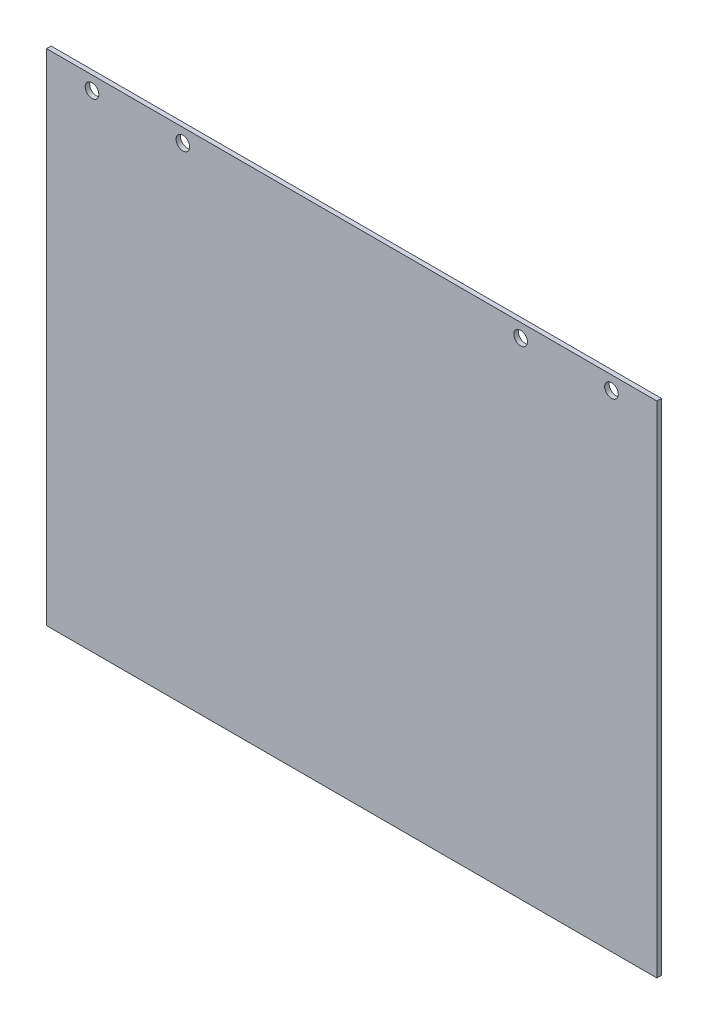
ISO-10303-21;
HEADER;
FILE_DESCRIPTION(('STEP AP214'),'2;1');
FILE_NAME('part.step','',(''),(''),'','','');
FILE_SCHEMA(('AUTOMOTIVE_DESIGN { 1 0 10303 214 1 1 1 1 }'));
ENDSEC;
DATA;
#1=APPLICATION_CONTEXT('core data for automotive mechanical design processes');
#2=APPLICATION_PROTOCOL_DEFINITION('international standard','automotive_design',2000,#1);
#3=PRODUCT_CONTEXT('',#1,'mechanical');
#4=PRODUCT('Part','Part','',(#3));
#5=PRODUCT_RELATED_PRODUCT_CATEGORY('part','',(#4));
#6=PRODUCT_DEFINITION_FORMATION('','',#4);
#7=PRODUCT_DEFINITION_CONTEXT('part definition',#1,'design');
#8=PRODUCT_DEFINITION('design','',#6,#7);
#9=PRODUCT_DEFINITION_SHAPE('','',#8);
#10=(LENGTH_UNIT() NAMED_UNIT(*) SI_UNIT(.MILLI.,.METRE.));
#11=(NAMED_UNIT(*) PLANE_ANGLE_UNIT() SI_UNIT($,.RADIAN.));
#12=(NAMED_UNIT(*) SI_UNIT($,.STERADIAN.) SOLID_ANGLE_UNIT());
#13=UNCERTAINTY_MEASURE_WITH_UNIT(LENGTH_MEASURE(1.E-05),#10,'distance_accuracy_value','');
#14=(GEOMETRIC_REPRESENTATION_CONTEXT(3) GLOBAL_UNCERTAINTY_ASSIGNED_CONTEXT((#13)) GLOBAL_UNIT_ASSIGNED_CONTEXT((#10,
#11,#12)) REPRESENTATION_CONTEXT('',''));
#15=CARTESIAN_POINT('',(0.,0.,0.));
#16=DIRECTION('',(0.,0.,1.));
#17=DIRECTION('',(1.,0.,0.));
#18=AXIS2_PLACEMENT_3D('',#15,#16,#17);
#19=CARTESIAN_POINT('',(0.,0.,1.));
#20=DIRECTION('',(0.,0.,-1.));
#21=DIRECTION('',(-1.,0.,0.));
#22=AXIS2_PLACEMENT_3D('',#19,#20,#21);
#23=PLANE('',#22);
#24=DIRECTION('',(0.,-1.,0.));
#25=VECTOR('',#24,1.);
#26=CARTESIAN_POINT('',(0.,0.,1.));
#27=LINE('',#26,#25);
#28=CARTESIAN_POINT('',(0.,110.,1.));
#29=VERTEX_POINT('',#28);
#30=CARTESIAN_POINT('',(0.,0.,1.));
#31=VERTEX_POINT('',#30);
#32=EDGE_CURVE('E93',#29,#31,#27,.T.);
#33=ORIENTED_EDGE('',*,*,#32,.T.);
#34=DIRECTION('',(1.,0.,0.));
#35=VECTOR('',#34,1.);
#36=CARTESIAN_POINT('',(0.,0.,1.));
#37=LINE('',#36,#35);
#38=CARTESIAN_POINT('',(134.350288425444,0.,1.));
#39=VERTEX_POINT('',#38);
#40=EDGE_CURVE('E88',#31,#39,#37,.T.);
#41=ORIENTED_EDGE('',*,*,#40,.T.);
#42=DIRECTION('',(0.,1.,0.));
#43=VECTOR('',#42,1.);
#44=CARTESIAN_POINT('',(134.350288425444,0.,1.));
#45=LINE('',#44,#43);
#46=CARTESIAN_POINT('',(134.350288425444,110.,1.));
#47=VERTEX_POINT('',#46);
#48=EDGE_CURVE('E91',#39,#47,#45,.T.);
#49=ORIENTED_EDGE('',*,*,#48,.T.);
#50=DIRECTION('',(-1.,0.,0.));
#51=VECTOR('',#50,1.);
#52=CARTESIAN_POINT('',(0.,110.,1.));
#53=LINE('',#52,#51);
#54=EDGE_CURVE('E58',#47,#29,#53,.T.);
#55=ORIENTED_EDGE('',*,*,#54,.T.);
#56=EDGE_LOOP('',(#33,#41,#49,#55));
#57=FACE_BOUND('',#56,.T.);
#58=CARTESIAN_POINT('',(10.,107.,1.));
#59=DIRECTION('',(0.,0.,1.));
#60=DIRECTION('',(1.,0.,0.));
#61=AXIS2_PLACEMENT_3D('',#58,#59,#60);
#62=CIRCLE('',#61,1.5);
#63=CARTESIAN_POINT('',(11.5,107.,1.));
#64=VERTEX_POINT('',#63);
#65=EDGE_CURVE('E108',#64,#64,#62,.T.);
#66=ORIENTED_EDGE('',*,*,#65,.F.);
#67=EDGE_LOOP('',(#66));
#68=FACE_BOUND('',#67,.T.);
#69=CARTESIAN_POINT('',(30.,107.,1.));
#70=DIRECTION('',(0.,0.,1.));
#71=DIRECTION('',(1.,0.,0.));
#72=AXIS2_PLACEMENT_3D('',#69,#70,#71);
#73=CIRCLE('',#72,1.50000000000001);
#74=CARTESIAN_POINT('',(31.5,107.,1.));
#75=VERTEX_POINT('',#74);
#76=EDGE_CURVE('E123',#75,#75,#73,.T.);
#77=ORIENTED_EDGE('',*,*,#76,.F.);
#78=EDGE_LOOP('',(#77));
#79=FACE_BOUND('',#78,.T.);
#80=CARTESIAN_POINT('',(104.350288425444,107.,1.));
#81=DIRECTION('',(0.,0.,1.));
#82=DIRECTION('',(-1.,0.,0.));
#83=AXIS2_PLACEMENT_3D('',#80,#81,#82);
#84=CIRCLE('',#83,1.50000000000001);
#85=CARTESIAN_POINT('',(102.850288425444,107.,1.));
#86=VERTEX_POINT('',#85);
#87=EDGE_CURVE('E129',#86,#86,#84,.T.);
#88=ORIENTED_EDGE('',*,*,#87,.F.);
#89=EDGE_LOOP('',(#88));
#90=FACE_BOUND('',#89,.T.);
#91=CARTESIAN_POINT('',(124.350288425444,107.,1.));
#92=DIRECTION('',(0.,0.,1.));
#93=DIRECTION('',(-1.,0.,0.));
#94=AXIS2_PLACEMENT_3D('',#91,#92,#93);
#95=CIRCLE('',#94,1.49999999999998);
#96=CARTESIAN_POINT('',(122.850288425444,107.,1.));
#97=VERTEX_POINT('',#96);
#98=EDGE_CURVE('E135',#97,#97,#95,.T.);
#99=ORIENTED_EDGE('',*,*,#98,.F.);
#100=EDGE_LOOP('',(#99));
#101=FACE_BOUND('',#100,.T.);
#102=ADVANCED_FACE('F41',(#57,#68,#79,#90,#101),#23,.F.);
#103=CARTESIAN_POINT('',(0.,0.,0.));
#104=DIRECTION('',(0.,0.,-1.));
#105=DIRECTION('',(-1.,0.,0.));
#106=AXIS2_PLACEMENT_3D('',#103,#104,#105);
#107=PLANE('',#106);
#108=CARTESIAN_POINT('',(104.350288425444,107.,0.));
#109=DIRECTION('',(0.,0.,1.));
#110=DIRECTION('',(-1.,0.,0.));
#111=AXIS2_PLACEMENT_3D('',#108,#109,#110);
#112=CIRCLE('',#111,1.50000000000001);
#113=CARTESIAN_POINT('',(102.850288425444,107.,0.));
#114=VERTEX_POINT('',#113);
#115=EDGE_CURVE('E132',#114,#114,#112,.T.);
#116=ORIENTED_EDGE('',*,*,#115,.T.);
#117=EDGE_LOOP('',(#116));
#118=FACE_BOUND('',#117,.T.);
#119=CARTESIAN_POINT('',(10.,107.,0.));
#120=DIRECTION('',(0.,0.,1.));
#121=DIRECTION('',(1.,0.,0.));
#122=AXIS2_PLACEMENT_3D('',#119,#120,#121);
#123=CIRCLE('',#122,1.5);
#124=CARTESIAN_POINT('',(11.5,107.,0.));
#125=VERTEX_POINT('',#124);
#126=EDGE_CURVE('E120',#125,#125,#123,.T.);
#127=ORIENTED_EDGE('',*,*,#126,.T.);
#128=EDGE_LOOP('',(#127));
#129=FACE_BOUND('',#128,.T.);
#130=DIRECTION('',(0.,-1.,0.));
#131=VECTOR('',#130,1.);
#132=CARTESIAN_POINT('',(0.,0.,0.));
#133=LINE('',#132,#131);
#134=CARTESIAN_POINT('',(0.,110.,0.));
#135=VERTEX_POINT('',#134);
#136=CARTESIAN_POINT('',(0.,0.,0.));
#137=VERTEX_POINT('',#136);
#138=EDGE_CURVE('E105',#135,#137,#133,.T.);
#139=ORIENTED_EDGE('',*,*,#138,.F.);
#140=DIRECTION('',(-1.,0.,0.));
#141=VECTOR('',#140,1.);
#142=CARTESIAN_POINT('',(0.,110.,0.));
#143=LINE('',#142,#141);
#144=CARTESIAN_POINT('',(134.350288425444,110.,0.));
#145=VERTEX_POINT('',#144);
#146=EDGE_CURVE('E81',#145,#135,#143,.T.);
#147=ORIENTED_EDGE('',*,*,#146,.F.);
#148=DIRECTION('',(0.,1.,0.));
#149=VECTOR('',#148,1.);
#150=CARTESIAN_POINT('',(134.350288425444,0.,0.));
#151=LINE('',#150,#149);
#152=CARTESIAN_POINT('',(134.350288425444,0.,0.));
#153=VERTEX_POINT('',#152);
#154=EDGE_CURVE('E75',#153,#145,#151,.T.);
#155=ORIENTED_EDGE('',*,*,#154,.F.);
#156=DIRECTION('',(1.,0.,0.));
#157=VECTOR('',#156,1.);
#158=CARTESIAN_POINT('',(0.,0.,0.));
#159=LINE('',#158,#157);
#160=EDGE_CURVE('E97',#137,#153,#159,.T.);
#161=ORIENTED_EDGE('',*,*,#160,.F.);
#162=EDGE_LOOP('',(#139,#147,#155,#161));
#163=FACE_BOUND('',#162,.T.);
#164=CARTESIAN_POINT('',(30.,107.,0.));
#165=DIRECTION('',(0.,0.,1.));
#166=DIRECTION('',(1.,0.,0.));
#167=AXIS2_PLACEMENT_3D('',#164,#165,#166);
#168=CIRCLE('',#167,1.50000000000001);
#169=CARTESIAN_POINT('',(31.5,107.,0.));
#170=VERTEX_POINT('',#169);
#171=EDGE_CURVE('E126',#170,#170,#168,.T.);
#172=ORIENTED_EDGE('',*,*,#171,.T.);
#173=EDGE_LOOP('',(#172));
#174=FACE_BOUND('',#173,.T.);
#175=CARTESIAN_POINT('',(124.350288425444,107.,0.));
#176=DIRECTION('',(0.,0.,1.));
#177=DIRECTION('',(-1.,0.,0.));
#178=AXIS2_PLACEMENT_3D('',#175,#176,#177);
#179=CIRCLE('',#178,1.49999999999998);
#180=CARTESIAN_POINT('',(122.850288425444,107.,0.));
#181=VERTEX_POINT('',#180);
#182=EDGE_CURVE('E138',#181,#181,#179,.T.);
#183=ORIENTED_EDGE('',*,*,#182,.T.);
#184=EDGE_LOOP('',(#183));
#185=FACE_BOUND('',#184,.T.);
#186=ADVANCED_FACE('F116',(#118,#129,#163,#174,#185),#107,.T.);
#187=CARTESIAN_POINT('',(0.,0.,1.));
#188=DIRECTION('',(1.,0.,0.));
#189=DIRECTION('',(0.,0.,-1.));
#190=AXIS2_PLACEMENT_3D('',#187,#188,#189);
#191=PLANE('',#190);
#192=ORIENTED_EDGE('',*,*,#138,.T.);
#193=DIRECTION('',(0.,0.,-1.));
#194=VECTOR('',#193,1.);
#195=CARTESIAN_POINT('',(0.,0.,1.));
#196=LINE('',#195,#194);
#197=EDGE_CURVE('E11',#31,#137,#196,.T.);
#198=ORIENTED_EDGE('',*,*,#197,.F.);
#199=ORIENTED_EDGE('',*,*,#32,.F.);
#200=DIRECTION('',(0.,0.,-1.));
#201=VECTOR('',#200,1.);
#202=CARTESIAN_POINT('',(0.,110.,1.));
#203=LINE('',#202,#201);
#204=EDGE_CURVE('E101',#29,#135,#203,.T.);
#205=ORIENTED_EDGE('',*,*,#204,.T.);
#206=EDGE_LOOP('',(#192,#198,#199,#205));
#207=FACE_BOUND('',#206,.T.);
#208=ADVANCED_FACE('F43',(#207),#191,.F.);
#209=CARTESIAN_POINT('',(0.,0.,1.));
#210=DIRECTION('',(0.,1.,0.));
#211=DIRECTION('',(0.,0.,1.));
#212=AXIS2_PLACEMENT_3D('',#209,#210,#211);
#213=PLANE('',#212);
#214=ORIENTED_EDGE('',*,*,#160,.T.);
#215=DIRECTION('',(0.,0.,-1.));
#216=VECTOR('',#215,1.);
#217=CARTESIAN_POINT('',(134.350288425444,0.,1.));
#218=LINE('',#217,#216);
#219=EDGE_CURVE('E50',#39,#153,#218,.T.);
#220=ORIENTED_EDGE('',*,*,#219,.F.);
#221=ORIENTED_EDGE('',*,*,#40,.F.);
#222=ORIENTED_EDGE('',*,*,#197,.T.);
#223=EDGE_LOOP('',(#214,#220,#221,#222));
#224=FACE_BOUND('',#223,.T.);
#225=ADVANCED_FACE('F96',(#224),#213,.F.);
#226=CARTESIAN_POINT('',(134.350288425444,0.,1.));
#227=DIRECTION('',(-1.,0.,0.));
#228=DIRECTION('',(0.,-1.,0.));
#229=AXIS2_PLACEMENT_3D('',#226,#227,#228);
#230=PLANE('',#229);
#231=ORIENTED_EDGE('',*,*,#154,.T.);
#232=DIRECTION('',(0.,0.,-1.));
#233=VECTOR('',#232,1.);
#234=CARTESIAN_POINT('',(134.350288425444,110.,1.));
#235=LINE('',#234,#233);
#236=EDGE_CURVE('E98',#47,#145,#235,.T.);
#237=ORIENTED_EDGE('',*,*,#236,.F.);
#238=ORIENTED_EDGE('',*,*,#48,.F.);
#239=ORIENTED_EDGE('',*,*,#219,.T.);
#240=EDGE_LOOP('',(#231,#237,#238,#239));
#241=FACE_BOUND('',#240,.T.);
#242=ADVANCED_FACE('F99',(#241),#230,.F.);
#243=CARTESIAN_POINT('',(0.,110.,1.));
#244=DIRECTION('',(0.,-1.,0.));
#245=DIRECTION('',(1.,0.,0.));
#246=AXIS2_PLACEMENT_3D('',#243,#244,#245);
#247=PLANE('',#246);
#248=ORIENTED_EDGE('',*,*,#146,.T.);
#249=ORIENTED_EDGE('',*,*,#204,.F.);
#250=ORIENTED_EDGE('',*,*,#54,.F.);
#251=ORIENTED_EDGE('',*,*,#236,.T.);
#252=EDGE_LOOP('',(#248,#249,#250,#251));
#253=FACE_BOUND('',#252,.T.);
#254=ADVANCED_FACE('F113',(#253),#247,.F.);
#255=CARTESIAN_POINT('',(10.,107.,1.));
#256=DIRECTION('',(0.,0.,-1.));
#257=DIRECTION('',(-1.,0.,0.));
#258=AXIS2_PLACEMENT_3D('',#255,#256,#257);
#259=CYLINDRICAL_SURFACE('',#258,1.5);
#260=ORIENTED_EDGE('',*,*,#65,.T.);
#261=EDGE_LOOP('',(#260));
#262=FACE_BOUND('',#261,.T.);
#263=ORIENTED_EDGE('',*,*,#126,.F.);
#264=EDGE_LOOP('',(#263));
#265=FACE_BOUND('',#264,.T.);
#266=ADVANCED_FACE('F155',(#262,#265),#259,.F.);
#267=CARTESIAN_POINT('',(30.,107.,1.));
#268=DIRECTION('',(0.,0.,-1.));
#269=DIRECTION('',(-1.,0.,0.));
#270=AXIS2_PLACEMENT_3D('',#267,#268,#269);
#271=CYLINDRICAL_SURFACE('',#270,1.50000000000001);
#272=ORIENTED_EDGE('',*,*,#76,.T.);
#273=EDGE_LOOP('',(#272));
#274=FACE_BOUND('',#273,.T.);
#275=ORIENTED_EDGE('',*,*,#171,.F.);
#276=EDGE_LOOP('',(#275));
#277=FACE_BOUND('',#276,.T.);
#278=ADVANCED_FACE('F200',(#274,#277),#271,.F.);
#279=CARTESIAN_POINT('',(104.350288425444,107.,1.));
#280=DIRECTION('',(0.,0.,-1.));
#281=DIRECTION('',(-1.,0.,0.));
#282=AXIS2_PLACEMENT_3D('',#279,#280,#281);
#283=CYLINDRICAL_SURFACE('',#282,1.50000000000001);
#284=ORIENTED_EDGE('',*,*,#87,.T.);
#285=EDGE_LOOP('',(#284));
#286=FACE_BOUND('',#285,.T.);
#287=ORIENTED_EDGE('',*,*,#115,.F.);
#288=EDGE_LOOP('',(#287));
#289=FACE_BOUND('',#288,.T.);
#290=ADVANCED_FACE('F208',(#286,#289),#283,.F.);
#291=CARTESIAN_POINT('',(124.350288425444,107.,1.));
#292=DIRECTION('',(0.,0.,-1.));
#293=DIRECTION('',(-1.,0.,0.));
#294=AXIS2_PLACEMENT_3D('',#291,#292,#293);
#295=CYLINDRICAL_SURFACE('',#294,1.49999999999998);
#296=ORIENTED_EDGE('',*,*,#98,.T.);
#297=EDGE_LOOP('',(#296));
#298=FACE_BOUND('',#297,.T.);
#299=ORIENTED_EDGE('',*,*,#182,.F.);
#300=EDGE_LOOP('',(#299));
#301=FACE_BOUND('',#300,.T.);
#302=ADVANCED_FACE('F144',(#298,#301),#295,.F.);
#303=CLOSED_SHELL('',(#102,#186,#208,#225,#242,#254,#266,#278,#290,#302));
#304=MANIFOLD_SOLID_BREP('B2',#303);
#305=ADVANCED_BREP_SHAPE_REPRESENTATION('',(#18,#304),#14);
#306=SHAPE_DEFINITION_REPRESENTATION(#9,#305);
ENDSEC;
END-ISO-10303-21;
